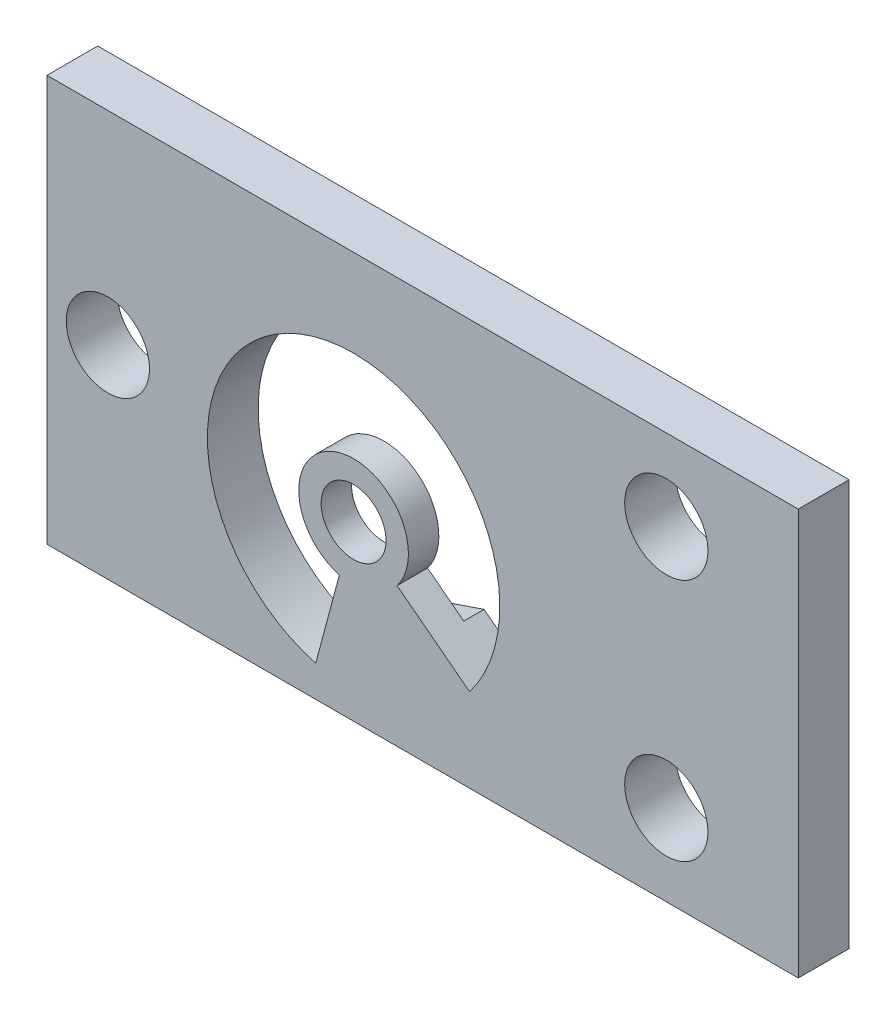
ISO-10303-21;
HEADER;
FILE_DESCRIPTION(('STEP AP214'),'2;1');
FILE_NAME('part.step','',(''),(''),'','','');
FILE_SCHEMA(('AUTOMOTIVE_DESIGN { 1 0 10303 214 1 1 1 1 }'));
ENDSEC;
DATA;
#1=APPLICATION_CONTEXT('core data for automotive mechanical design processes');
#2=APPLICATION_PROTOCOL_DEFINITION('international standard','automotive_design',2000,#1);
#3=PRODUCT_CONTEXT('',#1,'mechanical');
#4=PRODUCT('Part','Part','',(#3));
#5=PRODUCT_RELATED_PRODUCT_CATEGORY('part','',(#4));
#6=PRODUCT_DEFINITION_FORMATION('','',#4);
#7=PRODUCT_DEFINITION_CONTEXT('part definition',#1,'design');
#8=PRODUCT_DEFINITION('design','',#6,#7);
#9=PRODUCT_DEFINITION_SHAPE('','',#8);
#10=(LENGTH_UNIT() NAMED_UNIT(*) SI_UNIT(.MILLI.,.METRE.));
#11=(NAMED_UNIT(*) PLANE_ANGLE_UNIT() SI_UNIT($,.RADIAN.));
#12=(NAMED_UNIT(*) SI_UNIT($,.STERADIAN.) SOLID_ANGLE_UNIT());
#13=UNCERTAINTY_MEASURE_WITH_UNIT(LENGTH_MEASURE(1.E-05),#10,'distance_accuracy_value','');
#14=(GEOMETRIC_REPRESENTATION_CONTEXT(3) GLOBAL_UNCERTAINTY_ASSIGNED_CONTEXT((#13)) GLOBAL_UNIT_ASSIGNED_CONTEXT((#10,
#11,#12)) REPRESENTATION_CONTEXT('',''));
#15=CARTESIAN_POINT('',(0.,0.,0.));
#16=DIRECTION('',(0.,0.,1.));
#17=DIRECTION('',(1.,0.,0.));
#18=AXIS2_PLACEMENT_3D('',#15,#16,#17);
#19=CARTESIAN_POINT('',(0.,0.,0.));
#20=DIRECTION('',(0.,0.,1.));
#21=DIRECTION('',(1.,0.,0.));
#22=AXIS2_PLACEMENT_3D('',#19,#20,#21);
#23=PLANE('',#22);
#24=CARTESIAN_POINT('',(49.,6.,0.));
#25=DIRECTION('',(0.,0.,-1.));
#26=DIRECTION('',(-1.,0.,0.));
#27=AXIS2_PLACEMENT_3D('',#24,#25,#26);
#28=CIRCLE('',#27,2.05);
#29=CARTESIAN_POINT('',(46.95,6.,0.));
#30=VERTEX_POINT('',#29);
#31=EDGE_CURVE('E159',#30,#30,#28,.T.);
#32=ORIENTED_EDGE('',*,*,#31,.F.);
#33=EDGE_LOOP('',(#32));
#34=FACE_BOUND('',#33,.T.);
#35=CARTESIAN_POINT('',(49.,-6.,0.));
#36=DIRECTION('',(0.,0.,-1.));
#37=DIRECTION('',(-1.,0.,0.));
#38=AXIS2_PLACEMENT_3D('',#35,#36,#37);
#39=CIRCLE('',#38,2.05);
#40=CARTESIAN_POINT('',(46.95,-6.,0.));
#41=VERTEX_POINT('',#40);
#42=EDGE_CURVE('E162',#41,#41,#39,.T.);
#43=ORIENTED_EDGE('',*,*,#42,.F.);
#44=EDGE_LOOP('',(#43));
#45=FACE_BOUND('',#44,.T.);
#46=CARTESIAN_POINT('',(21.5,0.,0.));
#47=DIRECTION('',(0.,0.,-1.));
#48=DIRECTION('',(-1.,0.,0.));
#49=AXIS2_PLACEMENT_3D('',#46,#47,#48);
#50=CIRCLE('',#49,2.05);
#51=CARTESIAN_POINT('',(19.45,0.,0.));
#52=VERTEX_POINT('',#51);
#53=EDGE_CURVE('E165',#52,#52,#50,.T.);
#54=ORIENTED_EDGE('',*,*,#53,.F.);
#55=EDGE_LOOP('',(#54));
#56=FACE_BOUND('',#55,.T.);
#57=DIRECTION('',(-1.,0.,0.));
#58=VECTOR('',#57,1.);
#59=CARTESIAN_POINT('',(0.,-10.,0.));
#60=LINE('',#59,#58);
#61=CARTESIAN_POINT('',(55.5,-10.,0.));
#62=VERTEX_POINT('',#61);
#63=CARTESIAN_POINT('',(18.5,-10.,0.));
#64=VERTEX_POINT('',#63);
#65=EDGE_CURVE('E123',#62,#64,#60,.T.);
#66=ORIENTED_EDGE('',*,*,#65,.T.);
#67=DIRECTION('',(0.,1.,0.));
#68=VECTOR('',#67,1.);
#69=CARTESIAN_POINT('',(18.5,-10.,0.));
#70=LINE('',#69,#68);
#71=CARTESIAN_POINT('',(18.5,10.,0.));
#72=VERTEX_POINT('',#71);
#73=EDGE_CURVE('E112',#64,#72,#70,.T.);
#74=ORIENTED_EDGE('',*,*,#73,.T.);
#75=DIRECTION('',(-1.,0.,0.));
#76=VECTOR('',#75,1.);
#77=CARTESIAN_POINT('',(0.,10.,0.));
#78=LINE('',#77,#76);
#79=CARTESIAN_POINT('',(55.5,10.,0.));
#80=VERTEX_POINT('',#79);
#81=EDGE_CURVE('E39',#80,#72,#78,.T.);
#82=ORIENTED_EDGE('',*,*,#81,.F.);
#83=DIRECTION('',(0.,1.,0.));
#84=VECTOR('',#83,1.);
#85=CARTESIAN_POINT('',(55.5,0.,0.));
#86=LINE('',#85,#84);
#87=EDGE_CURVE('E129',#62,#80,#86,.T.);
#88=ORIENTED_EDGE('',*,*,#87,.F.);
#89=EDGE_LOOP('',(#66,#74,#82,#88));
#90=FACE_BOUND('',#89,.T.);
#91=DIRECTION('',(0.946935803503671,0.321422749728231,0.));
#92=VECTOR('',#91,1.);
#93=CARTESIAN_POINT('',(38.4282064652993,-4.20760458906788,0.));
#94=LINE('',#93,#92);
#95=CARTESIAN_POINT('',(32.3188457267425,-6.28133284013089,0.));
#96=VERTEX_POINT('',#95);
#97=CARTESIAN_POINT('',(37.5269926460127,-4.51350771662562,0.));
#98=VERTEX_POINT('',#97);
#99=EDGE_CURVE('E204',#96,#98,#94,.T.);
#100=ORIENTED_EDGE('',*,*,#99,.T.);
#101=DIRECTION('',(-0.793331847679335,0.608789437702144,0.));
#102=VECTOR('',#101,1.);
#103=CARTESIAN_POINT('',(35.015418355654,-2.58616809897714,0.));
#104=LINE('',#103,#102);
#105=CARTESIAN_POINT('',(39.3119893032912,-5.88328395145544,0.));
#106=VERTEX_POINT('',#105);
#107=EDGE_CURVE('E155',#106,#98,#104,.T.);
#108=ORIENTED_EDGE('',*,*,#107,.F.);
#109=CARTESIAN_POINT('',(33.6,-1.5,0.));
#110=DIRECTION('',(0.,0.,-1.));
#111=DIRECTION('',(-1.,0.,0.));
#112=AXIS2_PLACEMENT_3D('',#109,#110,#111);
#113=CIRCLE('',#112,7.2);
#114=CARTESIAN_POINT('',(31.7365028752618,-8.45466594928129,0.));
#115=VERTEX_POINT('',#114);
#116=EDGE_CURVE('E148',#106,#115,#113,.F.);
#117=ORIENTED_EDGE('',*,*,#116,.T.);
#118=DIRECTION('',(-0.258819045102522,-0.965925826289068,0.));
#119=VECTOR('',#118,1.);
#120=CARTESIAN_POINT('',(34.2027568135665,0.74951905283833,0.));
#121=LINE('',#120,#119);
#122=EDGE_CURVE('E152',#96,#115,#121,.T.);
#123=ORIENTED_EDGE('',*,*,#122,.F.);
#124=EDGE_LOOP('',(#100,#108,#117,#123));
#125=FACE_BOUND('',#124,.T.);
#126=ADVANCED_FACE('F35',(#34,#45,#56,#90,#125),#23,.F.);
#127=CARTESIAN_POINT('',(35.015418355654,-2.58616809897714,2.5));
#128=DIRECTION('',(-0.608789437702144,-0.793331847679335,0.));
#129=DIRECTION('',(0.793331847679335,-0.608789437702144,0.));
#130=AXIS2_PLACEMENT_3D('',#127,#128,#129);
#131=PLANE('',#130);
#132=DIRECTION('',(0.793331847679335,-0.608789437702144,0.));
#133=VECTOR('',#132,1.);
#134=CARTESIAN_POINT('',(35.015418355654,-2.58616809897714,1.));
#135=LINE('',#134,#133);
#136=CARTESIAN_POINT('',(35.7419959887342,-3.14373148179579,1.));
#137=VERTEX_POINT('',#136);
#138=CARTESIAN_POINT('',(37.5269926460127,-4.51350771662562,1.));
#139=VERTEX_POINT('',#138);
#140=EDGE_CURVE('E168',#137,#139,#135,.T.);
#141=ORIENTED_EDGE('',*,*,#140,.F.);
#142=DIRECTION('',(0.,0.,-1.));
#143=VECTOR('',#142,1.);
#144=CARTESIAN_POINT('',(35.7419959887342,-3.14373148179579,2.5));
#145=LINE('',#144,#143);
#146=CARTESIAN_POINT('',(35.7419959887342,-3.14373148179579,2.5));
#147=VERTEX_POINT('',#146);
#148=EDGE_CURVE('E130',#147,#137,#145,.T.);
#149=ORIENTED_EDGE('',*,*,#148,.F.);
#150=DIRECTION('',(-0.793331847679335,0.608789437702144,0.));
#151=VECTOR('',#150,1.);
#152=CARTESIAN_POINT('',(35.015418355654,-2.58616809897714,2.5));
#153=LINE('',#152,#151);
#154=CARTESIAN_POINT('',(39.3119893032912,-5.88328395145544,2.5));
#155=VERTEX_POINT('',#154);
#156=EDGE_CURVE('E176',#155,#147,#153,.T.);
#157=ORIENTED_EDGE('',*,*,#156,.F.);
#158=DIRECTION('',(0.,0.,-1.));
#159=VECTOR('',#158,1.);
#160=CARTESIAN_POINT('',(39.3119893032912,-5.88328395145544,2.5));
#161=LINE('',#160,#159);
#162=EDGE_CURVE('E139',#155,#106,#161,.T.);
#163=ORIENTED_EDGE('',*,*,#162,.T.);
#164=ORIENTED_EDGE('',*,*,#107,.T.);
#165=DIRECTION('',(0.,0.,-1.));
#166=VECTOR('',#165,1.);
#167=CARTESIAN_POINT('',(37.5269926460127,-4.51350771662562,1.));
#168=LINE('',#167,#166);
#169=EDGE_CURVE('E199',#139,#98,#168,.T.);
#170=ORIENTED_EDGE('',*,*,#169,.F.);
#171=EDGE_LOOP('',(#141,#149,#157,#163,#164,#170));
#172=FACE_BOUND('',#171,.T.);
#173=ADVANCED_FACE('F234',(#172),#131,.F.);
#174=CARTESIAN_POINT('',(33.6,-1.5,2.5));
#175=DIRECTION('',(0.,0.,-1.));
#176=DIRECTION('',(-1.,0.,0.));
#177=AXIS2_PLACEMENT_3D('',#174,#175,#176);
#178=CYLINDRICAL_SURFACE('',#177,2.7);
#179=ORIENTED_EDGE('',*,*,#148,.T.);
#180=CARTESIAN_POINT('',(33.6,-1.5,1.));
#181=DIRECTION('',(0.,0.,-1.));
#182=DIRECTION('',(-1.,0.,0.));
#183=AXIS2_PLACEMENT_3D('',#180,#181,#182);
#184=CIRCLE('',#183,2.7);
#185=CARTESIAN_POINT('',(32.9011885782232,-4.10799973098048,1.));
#186=VERTEX_POINT('',#185);
#187=EDGE_CURVE('E193',#137,#186,#184,.F.);
#188=ORIENTED_EDGE('',*,*,#187,.T.);
#189=DIRECTION('',(0.,0.,-1.));
#190=VECTOR('',#189,1.);
#191=CARTESIAN_POINT('',(32.9011885782232,-4.10799973098048,2.5));
#192=LINE('',#191,#190);
#193=CARTESIAN_POINT('',(32.9011885782232,-4.10799973098048,2.5));
#194=VERTEX_POINT('',#193);
#195=EDGE_CURVE('E132',#194,#186,#192,.T.);
#196=ORIENTED_EDGE('',*,*,#195,.F.);
#197=CARTESIAN_POINT('',(33.6,-1.5,2.5));
#198=DIRECTION('',(0.,0.,-1.));
#199=DIRECTION('',(-1.,0.,0.));
#200=AXIS2_PLACEMENT_3D('',#197,#198,#199);
#201=CIRCLE('',#200,2.7);
#202=EDGE_CURVE('E173',#194,#147,#201,.T.);
#203=ORIENTED_EDGE('',*,*,#202,.T.);
#204=EDGE_LOOP('',(#179,#188,#196,#203));
#205=FACE_BOUND('',#204,.T.);
#206=ADVANCED_FACE('F240',(#205),#178,.T.);
#207=CARTESIAN_POINT('',(34.2027568135665,0.74951905283833,2.5));
#208=DIRECTION('',(0.965925826289068,-0.258819045102522,0.));
#209=DIRECTION('',(0.258819045102522,0.965925826289068,0.));
#210=AXIS2_PLACEMENT_3D('',#207,#208,#209);
#211=PLANE('',#210);
#212=DIRECTION('',(0.258819045102522,0.965925826289068,0.));
#213=VECTOR('',#212,1.);
#214=CARTESIAN_POINT('',(34.2027568135665,0.74951905283833,1.));
#215=LINE('',#214,#213);
#216=CARTESIAN_POINT('',(32.3188457267425,-6.28133284013088,1.));
#217=VERTEX_POINT('',#216);
#218=EDGE_CURVE('E196',#217,#186,#215,.T.);
#219=ORIENTED_EDGE('',*,*,#218,.F.);
#220=DIRECTION('',(0.,0.,-1.));
#221=VECTOR('',#220,1.);
#222=CARTESIAN_POINT('',(32.3188457267425,-6.28133284013089,1.));
#223=LINE('',#222,#221);
#224=EDGE_CURVE('E198',#217,#96,#223,.T.);
#225=ORIENTED_EDGE('',*,*,#224,.T.);
#226=ORIENTED_EDGE('',*,*,#122,.T.);
#227=DIRECTION('',(0.,0.,-1.));
#228=VECTOR('',#227,1.);
#229=CARTESIAN_POINT('',(31.7365028752618,-8.45466594928129,2.5));
#230=LINE('',#229,#228);
#231=CARTESIAN_POINT('',(31.7365028752618,-8.45466594928129,2.5));
#232=VERTEX_POINT('',#231);
#233=EDGE_CURVE('E145',#232,#115,#230,.T.);
#234=ORIENTED_EDGE('',*,*,#233,.F.);
#235=DIRECTION('',(-0.258819045102522,-0.965925826289068,0.));
#236=VECTOR('',#235,1.);
#237=CARTESIAN_POINT('',(34.2027568135665,0.74951905283833,2.5));
#238=LINE('',#237,#236);
#239=EDGE_CURVE('E171',#194,#232,#238,.T.);
#240=ORIENTED_EDGE('',*,*,#239,.F.);
#241=ORIENTED_EDGE('',*,*,#195,.T.);
#242=EDGE_LOOP('',(#219,#225,#226,#234,#240,#241));
#243=FACE_BOUND('',#242,.T.);
#244=ADVANCED_FACE('F253',(#243),#211,.F.);
#245=CARTESIAN_POINT('',(33.6,-1.5,2.5));
#246=DIRECTION('',(0.,0.,-1.));
#247=DIRECTION('',(-1.,0.,0.));
#248=AXIS2_PLACEMENT_3D('',#245,#246,#247);
#249=CYLINDRICAL_SURFACE('',#248,1.6);
#250=CARTESIAN_POINT('',(33.6,-1.5,2.5));
#251=DIRECTION('',(0.,0.,-1.));
#252=DIRECTION('',(-1.,0.,0.));
#253=AXIS2_PLACEMENT_3D('',#250,#251,#252);
#254=CIRCLE('',#253,1.6);
#255=CARTESIAN_POINT('',(32.,-1.5,2.5));
#256=VERTEX_POINT('',#255);
#257=EDGE_CURVE('E151',#256,#256,#254,.T.);
#258=ORIENTED_EDGE('',*,*,#257,.F.);
#259=EDGE_LOOP('',(#258));
#260=FACE_BOUND('',#259,.T.);
#261=CARTESIAN_POINT('',(33.6,-1.5,1.));
#262=DIRECTION('',(0.,0.,1.));
#263=DIRECTION('',(1.,0.,0.));
#264=AXIS2_PLACEMENT_3D('',#261,#262,#263);
#265=CIRCLE('',#264,1.6);
#266=CARTESIAN_POINT('',(35.2,-1.5,1.));
#267=VERTEX_POINT('',#266);
#268=EDGE_CURVE('E201',#267,#267,#265,.F.);
#269=ORIENTED_EDGE('',*,*,#268,.T.);
#270=EDGE_LOOP('',(#269));
#271=FACE_BOUND('',#270,.T.);
#272=ADVANCED_FACE('F249',(#260,#271),#249,.F.);
#273=CARTESIAN_POINT('',(0.,-10.,2.5));
#274=DIRECTION('',(0.,-1.,0.));
#275=DIRECTION('',(1.,0.,0.));
#276=AXIS2_PLACEMENT_3D('',#273,#274,#275);
#277=PLANE('',#276);
#278=DIRECTION('',(0.,0.,-1.));
#279=VECTOR('',#278,1.);
#280=CARTESIAN_POINT('',(18.5,-10.,2.5));
#281=LINE('',#280,#279);
#282=CARTESIAN_POINT('',(18.5,-10.,2.5));
#283=VERTEX_POINT('',#282);
#284=EDGE_CURVE('E52',#283,#64,#281,.T.);
#285=ORIENTED_EDGE('',*,*,#284,.T.);
#286=ORIENTED_EDGE('',*,*,#65,.F.);
#287=DIRECTION('',(0.,0.,-1.));
#288=VECTOR('',#287,1.);
#289=CARTESIAN_POINT('',(55.5,-10.,2.5));
#290=LINE('',#289,#288);
#291=CARTESIAN_POINT('',(55.5,-10.,2.5));
#292=VERTEX_POINT('',#291);
#293=EDGE_CURVE('E140',#292,#62,#290,.T.);
#294=ORIENTED_EDGE('',*,*,#293,.F.);
#295=DIRECTION('',(-1.,0.,0.));
#296=VECTOR('',#295,1.);
#297=CARTESIAN_POINT('',(0.,-10.,2.5));
#298=LINE('',#297,#296);
#299=EDGE_CURVE('E44',#292,#283,#298,.T.);
#300=ORIENTED_EDGE('',*,*,#299,.T.);
#301=EDGE_LOOP('',(#285,#286,#294,#300));
#302=FACE_BOUND('',#301,.T.);
#303=ADVANCED_FACE('F37',(#302),#277,.T.);
#304=CARTESIAN_POINT('',(0.,10.,2.5));
#305=DIRECTION('',(0.,-1.,0.));
#306=DIRECTION('',(1.,0.,0.));
#307=AXIS2_PLACEMENT_3D('',#304,#305,#306);
#308=PLANE('',#307);
#309=ORIENTED_EDGE('',*,*,#81,.T.);
#310=DIRECTION('',(0.,0.,1.));
#311=VECTOR('',#310,1.);
#312=CARTESIAN_POINT('',(18.5,10.,0.));
#313=LINE('',#312,#311);
#314=CARTESIAN_POINT('',(18.5,10.,2.5));
#315=VERTEX_POINT('',#314);
#316=EDGE_CURVE('E115',#72,#315,#313,.T.);
#317=ORIENTED_EDGE('',*,*,#316,.T.);
#318=DIRECTION('',(-1.,0.,0.));
#319=VECTOR('',#318,1.);
#320=CARTESIAN_POINT('',(0.,10.,2.5));
#321=LINE('',#320,#319);
#322=CARTESIAN_POINT('',(55.5,10.,2.5));
#323=VERTEX_POINT('',#322);
#324=EDGE_CURVE('E11',#323,#315,#321,.T.);
#325=ORIENTED_EDGE('',*,*,#324,.F.);
#326=DIRECTION('',(0.,0.,-1.));
#327=VECTOR('',#326,1.);
#328=CARTESIAN_POINT('',(55.5,10.,2.5));
#329=LINE('',#328,#327);
#330=EDGE_CURVE('E136',#323,#80,#329,.T.);
#331=ORIENTED_EDGE('',*,*,#330,.T.);
#332=EDGE_LOOP('',(#309,#317,#325,#331));
#333=FACE_BOUND('',#332,.T.);
#334=ADVANCED_FACE('F213',(#333),#308,.F.);
#335=CARTESIAN_POINT('',(0.,0.,2.5));
#336=DIRECTION('',(0.,0.,1.));
#337=DIRECTION('',(1.,0.,0.));
#338=AXIS2_PLACEMENT_3D('',#335,#336,#337);
#339=PLANE('',#338);
#340=DIRECTION('',(0.,-1.,0.));
#341=VECTOR('',#340,1.);
#342=CARTESIAN_POINT('',(18.5,10.,2.5));
#343=LINE('',#342,#341);
#344=EDGE_CURVE('E207',#315,#283,#343,.T.);
#345=ORIENTED_EDGE('',*,*,#344,.T.);
#346=ORIENTED_EDGE('',*,*,#299,.F.);
#347=DIRECTION('',(0.,1.,0.));
#348=VECTOR('',#347,1.);
#349=CARTESIAN_POINT('',(55.5,0.,2.5));
#350=LINE('',#349,#348);
#351=EDGE_CURVE('E178',#292,#323,#350,.T.);
#352=ORIENTED_EDGE('',*,*,#351,.T.);
#353=ORIENTED_EDGE('',*,*,#324,.T.);
#354=EDGE_LOOP('',(#345,#346,#352,#353));
#355=FACE_BOUND('',#354,.T.);
#356=ORIENTED_EDGE('',*,*,#257,.T.);
#357=EDGE_LOOP('',(#356));
#358=FACE_BOUND('',#357,.T.);
#359=CARTESIAN_POINT('',(21.5,0.,2.5));
#360=DIRECTION('',(0.,0.,-1.));
#361=DIRECTION('',(-1.,0.,0.));
#362=AXIS2_PLACEMENT_3D('',#359,#360,#361);
#363=CIRCLE('',#362,2.05);
#364=CARTESIAN_POINT('',(19.45,0.,2.5));
#365=VERTEX_POINT('',#364);
#366=EDGE_CURVE('E187',#365,#365,#363,.T.);
#367=ORIENTED_EDGE('',*,*,#366,.T.);
#368=EDGE_LOOP('',(#367));
#369=FACE_BOUND('',#368,.T.);
#370=CARTESIAN_POINT('',(49.,-6.,2.5));
#371=DIRECTION('',(0.,0.,-1.));
#372=DIRECTION('',(-1.,0.,0.));
#373=AXIS2_PLACEMENT_3D('',#370,#371,#372);
#374=CIRCLE('',#373,2.05);
#375=CARTESIAN_POINT('',(46.95,-6.,2.5));
#376=VERTEX_POINT('',#375);
#377=EDGE_CURVE('E184',#376,#376,#374,.T.);
#378=ORIENTED_EDGE('',*,*,#377,.T.);
#379=EDGE_LOOP('',(#378));
#380=FACE_BOUND('',#379,.T.);
#381=CARTESIAN_POINT('',(49.,6.,2.5));
#382=DIRECTION('',(0.,0.,-1.));
#383=DIRECTION('',(-1.,0.,0.));
#384=AXIS2_PLACEMENT_3D('',#381,#382,#383);
#385=CIRCLE('',#384,2.05);
#386=CARTESIAN_POINT('',(46.95,6.,2.5));
#387=VERTEX_POINT('',#386);
#388=EDGE_CURVE('E181',#387,#387,#385,.T.);
#389=ORIENTED_EDGE('',*,*,#388,.T.);
#390=EDGE_LOOP('',(#389));
#391=FACE_BOUND('',#390,.T.);
#392=ORIENTED_EDGE('',*,*,#156,.T.);
#393=ORIENTED_EDGE('',*,*,#202,.F.);
#394=ORIENTED_EDGE('',*,*,#239,.T.);
#395=CARTESIAN_POINT('',(33.6,-1.5,2.5));
#396=DIRECTION('',(0.,0.,-1.));
#397=DIRECTION('',(-1.,0.,0.));
#398=AXIS2_PLACEMENT_3D('',#395,#396,#397);
#399=CIRCLE('',#398,7.2);
#400=EDGE_CURVE('E141',#155,#232,#399,.F.);
#401=ORIENTED_EDGE('',*,*,#400,.F.);
#402=EDGE_LOOP('',(#392,#393,#394,#401));
#403=FACE_BOUND('',#402,.T.);
#404=ADVANCED_FACE('F215',(#355,#358,#369,#380,#391,#403),#339,.T.);
#405=CARTESIAN_POINT('',(55.5,0.,2.5));
#406=DIRECTION('',(-1.,0.,0.));
#407=DIRECTION('',(0.,0.,1.));
#408=AXIS2_PLACEMENT_3D('',#405,#406,#407);
#409=PLANE('',#408);
#410=ORIENTED_EDGE('',*,*,#87,.T.);
#411=ORIENTED_EDGE('',*,*,#330,.F.);
#412=ORIENTED_EDGE('',*,*,#351,.F.);
#413=ORIENTED_EDGE('',*,*,#293,.T.);
#414=EDGE_LOOP('',(#410,#411,#412,#413));
#415=FACE_BOUND('',#414,.T.);
#416=ADVANCED_FACE('F220',(#415),#409,.F.);
#417=CARTESIAN_POINT('',(49.,6.,2.5));
#418=DIRECTION('',(0.,0.,-1.));
#419=DIRECTION('',(-1.,0.,0.));
#420=AXIS2_PLACEMENT_3D('',#417,#418,#419);
#421=CYLINDRICAL_SURFACE('',#420,2.05);
#422=ORIENTED_EDGE('',*,*,#388,.F.);
#423=EDGE_LOOP('',(#422));
#424=FACE_BOUND('',#423,.T.);
#425=ORIENTED_EDGE('',*,*,#31,.T.);
#426=EDGE_LOOP('',(#425));
#427=FACE_BOUND('',#426,.T.);
#428=ADVANCED_FACE('F222',(#424,#427),#421,.F.);
#429=CARTESIAN_POINT('',(49.,-6.,2.5));
#430=DIRECTION('',(0.,0.,-1.));
#431=DIRECTION('',(-1.,0.,0.));
#432=AXIS2_PLACEMENT_3D('',#429,#430,#431);
#433=CYLINDRICAL_SURFACE('',#432,2.05);
#434=ORIENTED_EDGE('',*,*,#377,.F.);
#435=EDGE_LOOP('',(#434));
#436=FACE_BOUND('',#435,.T.);
#437=ORIENTED_EDGE('',*,*,#42,.T.);
#438=EDGE_LOOP('',(#437));
#439=FACE_BOUND('',#438,.T.);
#440=ADVANCED_FACE('F228',(#436,#439),#433,.F.);
#441=CARTESIAN_POINT('',(21.5,0.,2.5));
#442=DIRECTION('',(0.,0.,-1.));
#443=DIRECTION('',(-1.,0.,0.));
#444=AXIS2_PLACEMENT_3D('',#441,#442,#443);
#445=CYLINDRICAL_SURFACE('',#444,2.05);
#446=ORIENTED_EDGE('',*,*,#366,.F.);
#447=EDGE_LOOP('',(#446));
#448=FACE_BOUND('',#447,.T.);
#449=ORIENTED_EDGE('',*,*,#53,.T.);
#450=EDGE_LOOP('',(#449));
#451=FACE_BOUND('',#450,.T.);
#452=ADVANCED_FACE('F263',(#448,#451),#445,.F.);
#453=CARTESIAN_POINT('',(33.6,-1.5,2.5));
#454=DIRECTION('',(0.,0.,-1.));
#455=DIRECTION('',(-1.,0.,0.));
#456=AXIS2_PLACEMENT_3D('',#453,#454,#455);
#457=CYLINDRICAL_SURFACE('',#456,7.2);
#458=ORIENTED_EDGE('',*,*,#116,.F.);
#459=ORIENTED_EDGE('',*,*,#162,.F.);
#460=ORIENTED_EDGE('',*,*,#400,.T.);
#461=ORIENTED_EDGE('',*,*,#233,.T.);
#462=EDGE_LOOP('',(#458,#459,#460,#461));
#463=FACE_BOUND('',#462,.T.);
#464=ADVANCED_FACE('F266',(#463),#457,.F.);
#465=CARTESIAN_POINT('',(37.,0.,1.));
#466=DIRECTION('',(0.,0.,-1.));
#467=DIRECTION('',(1.,0.,0.));
#468=AXIS2_PLACEMENT_3D('',#465,#466,#467);
#469=PLANE('',#468);
#470=ORIENTED_EDGE('',*,*,#268,.F.);
#471=EDGE_LOOP('',(#470));
#472=FACE_BOUND('',#471,.T.);
#473=ORIENTED_EDGE('',*,*,#140,.T.);
#474=DIRECTION('',(0.946935803503671,0.321422749728231,0.));
#475=VECTOR('',#474,1.);
#476=CARTESIAN_POINT('',(38.4282064652993,-4.20760458906788,1.));
#477=LINE('',#476,#475);
#478=EDGE_CURVE('E60',#217,#139,#477,.T.);
#479=ORIENTED_EDGE('',*,*,#478,.F.);
#480=ORIENTED_EDGE('',*,*,#218,.T.);
#481=ORIENTED_EDGE('',*,*,#187,.F.);
#482=EDGE_LOOP('',(#473,#479,#480,#481));
#483=FACE_BOUND('',#482,.T.);
#484=ADVANCED_FACE('F298',(#472,#483),#469,.T.);
#485=CARTESIAN_POINT('',(38.4282064652993,-4.20760458906788,1.));
#486=DIRECTION('',(-0.321422749728231,0.946935803503671,0.));
#487=DIRECTION('',(-0.946935803503671,-0.321422749728231,0.));
#488=AXIS2_PLACEMENT_3D('',#485,#486,#487);
#489=PLANE('',#488);
#490=ORIENTED_EDGE('',*,*,#99,.F.);
#491=ORIENTED_EDGE('',*,*,#224,.F.);
#492=ORIENTED_EDGE('',*,*,#478,.T.);
#493=ORIENTED_EDGE('',*,*,#169,.T.);
#494=EDGE_LOOP('',(#490,#491,#492,#493));
#495=FACE_BOUND('',#494,.T.);
#496=ADVANCED_FACE('F297',(#495),#489,.T.);
#497=CARTESIAN_POINT('',(18.5,0.,0.));
#498=DIRECTION('',(1.,0.,0.));
#499=DIRECTION('',(0.,0.,-1.));
#500=AXIS2_PLACEMENT_3D('',#497,#498,#499);
#501=PLANE('',#500);
#502=ORIENTED_EDGE('',*,*,#284,.F.);
#503=ORIENTED_EDGE('',*,*,#344,.F.);
#504=ORIENTED_EDGE('',*,*,#316,.F.);
#505=ORIENTED_EDGE('',*,*,#73,.F.);
#506=EDGE_LOOP('',(#502,#503,#504,#505));
#507=FACE_BOUND('',#506,.T.);
#508=ADVANCED_FACE('F113',(#507),#501,.F.);
#509=CLOSED_SHELL('',(#126,#173,#206,#244,#272,#303,#334,#404,#416,#428,#440,#452,#464,#484,
#496,#508));
#510=MANIFOLD_SOLID_BREP('B2',#509);
#511=ADVANCED_BREP_SHAPE_REPRESENTATION('',(#18,#510),#14);
#512=SHAPE_DEFINITION_REPRESENTATION(#9,#511);
ENDSEC;
END-ISO-10303-21;
